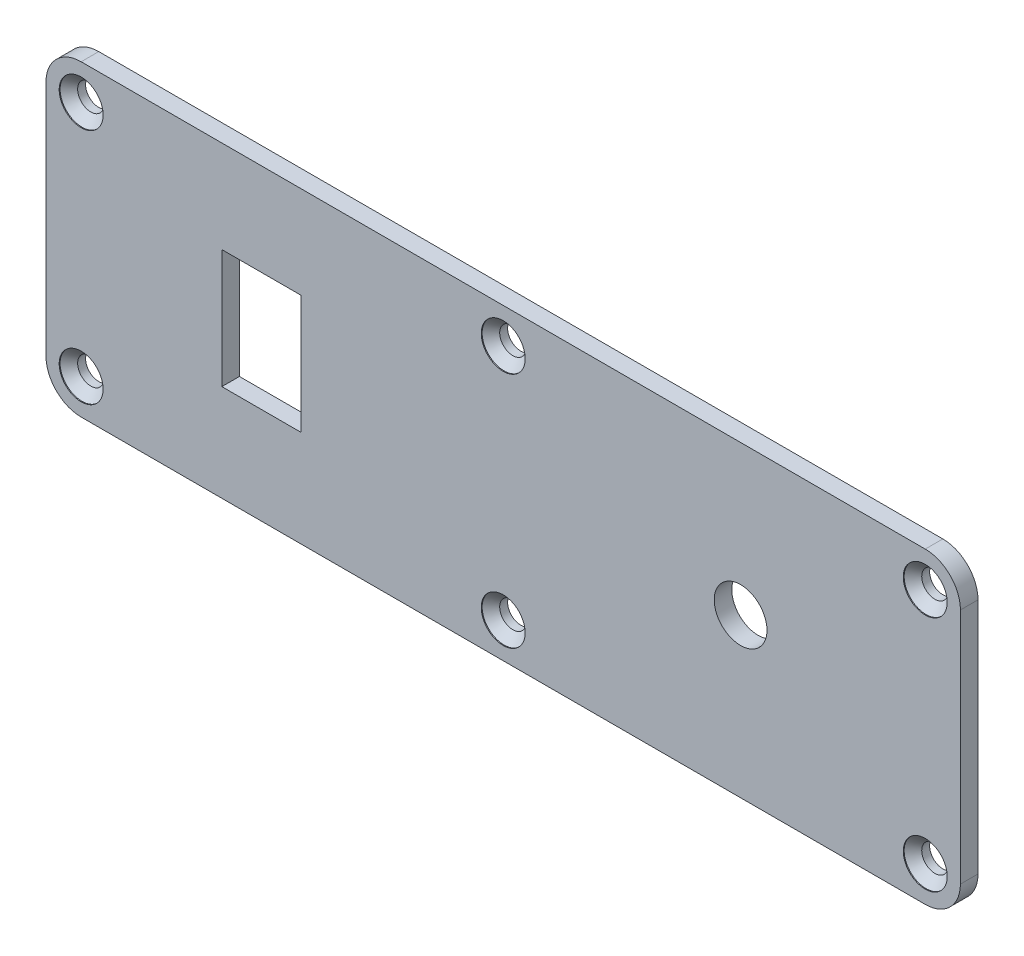
ISO-10303-21;
HEADER;
FILE_DESCRIPTION(('STEP AP214'),'2;1');
FILE_NAME('part.step','',(''),(''),'','','');
FILE_SCHEMA(('AUTOMOTIVE_DESIGN { 1 0 10303 214 1 1 1 1 }'));
ENDSEC;
DATA;
#1=APPLICATION_CONTEXT('core data for automotive mechanical design processes');
#2=APPLICATION_PROTOCOL_DEFINITION('international standard','automotive_design',2000,#1);
#3=PRODUCT_CONTEXT('',#1,'mechanical');
#4=PRODUCT('Part','Part','',(#3));
#5=PRODUCT_RELATED_PRODUCT_CATEGORY('part','',(#4));
#6=PRODUCT_DEFINITION_FORMATION('','',#4);
#7=PRODUCT_DEFINITION_CONTEXT('part definition',#1,'design');
#8=PRODUCT_DEFINITION('design','',#6,#7);
#9=PRODUCT_DEFINITION_SHAPE('','',#8);
#10=(LENGTH_UNIT() NAMED_UNIT(*) SI_UNIT(.MILLI.,.METRE.));
#11=(NAMED_UNIT(*) PLANE_ANGLE_UNIT() SI_UNIT($,.RADIAN.));
#12=(NAMED_UNIT(*) SI_UNIT($,.STERADIAN.) SOLID_ANGLE_UNIT());
#13=UNCERTAINTY_MEASURE_WITH_UNIT(LENGTH_MEASURE(1.E-05),#10,'distance_accuracy_value','');
#14=(GEOMETRIC_REPRESENTATION_CONTEXT(3) GLOBAL_UNCERTAINTY_ASSIGNED_CONTEXT((#13)) GLOBAL_UNIT_ASSIGNED_CONTEXT((#10,
#11,#12)) REPRESENTATION_CONTEXT('',''));
#15=CARTESIAN_POINT('',(0.,0.,0.));
#16=DIRECTION('',(0.,0.,1.));
#17=DIRECTION('',(1.,0.,0.));
#18=AXIS2_PLACEMENT_3D('',#15,#16,#17);
#19=CARTESIAN_POINT('',(-52.,4.00000000000001,0.));
#20=DIRECTION('',(0.,0.,1.));
#21=DIRECTION('',(1.,0.,0.));
#22=AXIS2_PLACEMENT_3D('',#19,#20,#21);
#23=CYLINDRICAL_SURFACE('',#22,1.5);
#24=CARTESIAN_POINT('',(-52.,4.00000000000001,0.900000000000003));
#25=DIRECTION('',(0.,0.,1.));
#26=DIRECTION('',(1.,0.,0.));
#27=AXIS2_PLACEMENT_3D('',#24,#25,#26);
#28=CIRCLE('',#27,1.5);
#29=CARTESIAN_POINT('',(-50.5,4.00000000000001,0.900000000000003));
#30=VERTEX_POINT('',#29);
#31=EDGE_CURVE('E251',#30,#30,#28,.T.);
#32=ORIENTED_EDGE('',*,*,#31,.T.);
#33=EDGE_LOOP('',(#32));
#34=FACE_BOUND('',#33,.T.);
#35=CARTESIAN_POINT('',(-52.,4.00000000000001,0.));
#36=DIRECTION('',(0.,0.,1.));
#37=DIRECTION('',(1.,0.,0.));
#38=AXIS2_PLACEMENT_3D('',#35,#36,#37);
#39=CIRCLE('',#38,1.5);
#40=CARTESIAN_POINT('',(-50.5,4.00000000000001,0.));
#41=VERTEX_POINT('',#40);
#42=EDGE_CURVE('E163',#41,#41,#39,.T.);
#43=ORIENTED_EDGE('',*,*,#42,.F.);
#44=EDGE_LOOP('',(#43));
#45=FACE_BOUND('',#44,.T.);
#46=ADVANCED_FACE('F33',(#34,#45),#23,.F.);
#47=CARTESIAN_POINT('',(-52.,31.,0.));
#48=DIRECTION('',(0.,0.,1.));
#49=DIRECTION('',(1.,0.,0.));
#50=AXIS2_PLACEMENT_3D('',#47,#48,#49);
#51=CYLINDRICAL_SURFACE('',#50,1.5);
#52=CARTESIAN_POINT('',(-52.,31.,0.899999999999989));
#53=DIRECTION('',(0.,0.,1.));
#54=DIRECTION('',(1.,0.,0.));
#55=AXIS2_PLACEMENT_3D('',#52,#53,#54);
#56=CIRCLE('',#55,1.5);
#57=CARTESIAN_POINT('',(-50.5,31.,0.899999999999989));
#58=VERTEX_POINT('',#57);
#59=EDGE_CURVE('E254',#58,#58,#56,.T.);
#60=ORIENTED_EDGE('',*,*,#59,.T.);
#61=EDGE_LOOP('',(#60));
#62=FACE_BOUND('',#61,.T.);
#63=CARTESIAN_POINT('',(-52.,31.,0.));
#64=DIRECTION('',(0.,0.,1.));
#65=DIRECTION('',(1.,0.,0.));
#66=AXIS2_PLACEMENT_3D('',#63,#64,#65);
#67=CIRCLE('',#66,1.5);
#68=CARTESIAN_POINT('',(-50.5,31.,0.));
#69=VERTEX_POINT('',#68);
#70=EDGE_CURVE('E174',#69,#69,#67,.T.);
#71=ORIENTED_EDGE('',*,*,#70,.F.);
#72=EDGE_LOOP('',(#71));
#73=FACE_BOUND('',#72,.T.);
#74=ADVANCED_FACE('F334',(#62,#73),#51,.F.);
#75=CARTESIAN_POINT('',(-100.,31.,0.));
#76=DIRECTION('',(0.,0.,1.));
#77=DIRECTION('',(1.,0.,0.));
#78=AXIS2_PLACEMENT_3D('',#75,#76,#77);
#79=CYLINDRICAL_SURFACE('',#78,1.5);
#80=CARTESIAN_POINT('',(-100.,31.,0.899999999999976));
#81=DIRECTION('',(0.,0.,1.));
#82=DIRECTION('',(1.,0.,0.));
#83=AXIS2_PLACEMENT_3D('',#80,#81,#82);
#84=CIRCLE('',#83,1.5);
#85=CARTESIAN_POINT('',(-98.5,31.,0.899999999999976));
#86=VERTEX_POINT('',#85);
#87=EDGE_CURVE('E248',#86,#86,#84,.T.);
#88=ORIENTED_EDGE('',*,*,#87,.T.);
#89=EDGE_LOOP('',(#88));
#90=FACE_BOUND('',#89,.T.);
#91=CARTESIAN_POINT('',(-100.,31.,0.));
#92=DIRECTION('',(0.,0.,1.));
#93=DIRECTION('',(1.,0.,0.));
#94=AXIS2_PLACEMENT_3D('',#91,#92,#93);
#95=CIRCLE('',#94,1.5);
#96=CARTESIAN_POINT('',(-98.5,31.,0.));
#97=VERTEX_POINT('',#96);
#98=EDGE_CURVE('E207',#97,#97,#95,.T.);
#99=ORIENTED_EDGE('',*,*,#98,.F.);
#100=EDGE_LOOP('',(#99));
#101=FACE_BOUND('',#100,.T.);
#102=ADVANCED_FACE('F340',(#90,#101),#79,.F.);
#103=CARTESIAN_POINT('',(-100.,3.99999999999999,0.));
#104=DIRECTION('',(0.,0.,1.));
#105=DIRECTION('',(1.,0.,0.));
#106=AXIS2_PLACEMENT_3D('',#103,#104,#105);
#107=CYLINDRICAL_SURFACE('',#106,1.5);
#108=CARTESIAN_POINT('',(-100.,3.99999999999999,0.89999999999999));
#109=DIRECTION('',(0.,0.,1.));
#110=DIRECTION('',(1.,0.,0.));
#111=AXIS2_PLACEMENT_3D('',#108,#109,#110);
#112=CIRCLE('',#111,1.5);
#113=CARTESIAN_POINT('',(-98.5,3.99999999999999,0.89999999999999));
#114=VERTEX_POINT('',#113);
#115=EDGE_CURVE('E245',#114,#114,#112,.T.);
#116=ORIENTED_EDGE('',*,*,#115,.T.);
#117=EDGE_LOOP('',(#116));
#118=FACE_BOUND('',#117,.T.);
#119=CARTESIAN_POINT('',(-100.,3.99999999999999,0.));
#120=DIRECTION('',(0.,0.,1.));
#121=DIRECTION('',(1.,0.,0.));
#122=AXIS2_PLACEMENT_3D('',#119,#120,#121);
#123=CIRCLE('',#122,1.5);
#124=CARTESIAN_POINT('',(-98.5,3.99999999999999,0.));
#125=VERTEX_POINT('',#124);
#126=EDGE_CURVE('E204',#125,#125,#123,.T.);
#127=ORIENTED_EDGE('',*,*,#126,.F.);
#128=EDGE_LOOP('',(#127));
#129=FACE_BOUND('',#128,.T.);
#130=ADVANCED_FACE('F364',(#118,#129),#107,.F.);
#131=CARTESIAN_POINT('',(0.,0.,2.));
#132=DIRECTION('',(-1.,0.,0.));
#133=DIRECTION('',(0.,0.,1.));
#134=AXIS2_PLACEMENT_3D('',#131,#132,#133);
#135=PLANE('',#134);
#136=DIRECTION('',(0.,1.,0.));
#137=VECTOR('',#136,1.);
#138=CARTESIAN_POINT('',(0.,0.,2.));
#139=LINE('',#138,#137);
#140=CARTESIAN_POINT('',(0.,4.,2.));
#141=VERTEX_POINT('',#140);
#142=CARTESIAN_POINT('',(0.,31.,2.));
#143=VERTEX_POINT('',#142);
#144=EDGE_CURVE('E216',#141,#143,#139,.T.);
#145=ORIENTED_EDGE('',*,*,#144,.F.);
#146=DIRECTION('',(0.,0.,-1.));
#147=VECTOR('',#146,1.);
#148=CARTESIAN_POINT('',(0.,4.,2.));
#149=LINE('',#148,#147);
#150=CARTESIAN_POINT('',(0.,4.,0.));
#151=VERTEX_POINT('',#150);
#152=EDGE_CURVE('E259',#141,#151,#149,.T.);
#153=ORIENTED_EDGE('',*,*,#152,.T.);
#154=DIRECTION('',(0.,1.,0.));
#155=VECTOR('',#154,1.);
#156=CARTESIAN_POINT('',(0.,0.,0.));
#157=LINE('',#156,#155);
#158=CARTESIAN_POINT('',(0.,31.,0.));
#159=VERTEX_POINT('',#158);
#160=EDGE_CURVE('E215',#151,#159,#157,.T.);
#161=ORIENTED_EDGE('',*,*,#160,.T.);
#162=DIRECTION('',(0.,0.,-1.));
#163=VECTOR('',#162,1.);
#164=CARTESIAN_POINT('',(0.,31.,2.));
#165=LINE('',#164,#163);
#166=EDGE_CURVE('E257',#159,#143,#165,.F.);
#167=ORIENTED_EDGE('',*,*,#166,.T.);
#168=EDGE_LOOP('',(#145,#153,#161,#167));
#169=FACE_BOUND('',#168,.T.);
#170=ADVANCED_FACE('F316',(#169),#135,.F.);
#171=CARTESIAN_POINT('',(0.,35.,2.));
#172=DIRECTION('',(0.,-1.,0.));
#173=DIRECTION('',(1.,0.,0.));
#174=AXIS2_PLACEMENT_3D('',#171,#172,#173);
#175=PLANE('',#174);
#176=DIRECTION('',(-1.,0.,0.));
#177=VECTOR('',#176,1.);
#178=CARTESIAN_POINT('',(0.,35.,2.));
#179=LINE('',#178,#177);
#180=CARTESIAN_POINT('',(-4.,35.,2.));
#181=VERTEX_POINT('',#180);
#182=CARTESIAN_POINT('',(-100.,35.,2.));
#183=VERTEX_POINT('',#182);
#184=EDGE_CURVE('E219',#181,#183,#179,.T.);
#185=ORIENTED_EDGE('',*,*,#184,.F.);
#186=DIRECTION('',(0.,0.,-1.));
#187=VECTOR('',#186,1.);
#188=CARTESIAN_POINT('',(-4.,35.,2.));
#189=LINE('',#188,#187);
#190=CARTESIAN_POINT('',(-4.,35.,0.));
#191=VERTEX_POINT('',#190);
#192=EDGE_CURVE('E285',#181,#191,#189,.T.);
#193=ORIENTED_EDGE('',*,*,#192,.T.);
#194=DIRECTION('',(-1.,0.,0.));
#195=VECTOR('',#194,1.);
#196=CARTESIAN_POINT('',(0.,35.,0.));
#197=LINE('',#196,#195);
#198=CARTESIAN_POINT('',(-100.,35.,0.));
#199=VERTEX_POINT('',#198);
#200=EDGE_CURVE('E232',#191,#199,#197,.T.);
#201=ORIENTED_EDGE('',*,*,#200,.T.);
#202=DIRECTION('',(0.,0.,-1.));
#203=VECTOR('',#202,1.);
#204=CARTESIAN_POINT('',(-100.,35.,2.));
#205=LINE('',#204,#203);
#206=EDGE_CURVE('E283',#199,#183,#205,.F.);
#207=ORIENTED_EDGE('',*,*,#206,.T.);
#208=EDGE_LOOP('',(#185,#193,#201,#207));
#209=FACE_BOUND('',#208,.T.);
#210=ADVANCED_FACE('F324',(#209),#175,.F.);
#211=CARTESIAN_POINT('',(-104.,0.,2.));
#212=DIRECTION('',(1.,0.,0.));
#213=DIRECTION('',(0.,0.,-1.));
#214=AXIS2_PLACEMENT_3D('',#211,#212,#213);
#215=PLANE('',#214);
#216=DIRECTION('',(0.,-1.,0.));
#217=VECTOR('',#216,1.);
#218=CARTESIAN_POINT('',(-104.,0.,0.));
#219=LINE('',#218,#217);
#220=CARTESIAN_POINT('',(-104.,31.,0.));
#221=VERTEX_POINT('',#220);
#222=CARTESIAN_POINT('',(-104.,4.,0.));
#223=VERTEX_POINT('',#222);
#224=EDGE_CURVE('E235',#221,#223,#219,.T.);
#225=ORIENTED_EDGE('',*,*,#224,.T.);
#226=DIRECTION('',(0.,0.,-1.));
#227=VECTOR('',#226,1.);
#228=CARTESIAN_POINT('',(-104.,4.,2.));
#229=LINE('',#228,#227);
#230=CARTESIAN_POINT('',(-104.,4.,2.));
#231=VERTEX_POINT('',#230);
#232=EDGE_CURVE('E11',#223,#231,#229,.F.);
#233=ORIENTED_EDGE('',*,*,#232,.T.);
#234=DIRECTION('',(0.,-1.,0.));
#235=VECTOR('',#234,1.);
#236=CARTESIAN_POINT('',(-104.,0.,2.));
#237=LINE('',#236,#235);
#238=CARTESIAN_POINT('',(-104.,31.,2.));
#239=VERTEX_POINT('',#238);
#240=EDGE_CURVE('E223',#239,#231,#237,.T.);
#241=ORIENTED_EDGE('',*,*,#240,.F.);
#242=DIRECTION('',(0.,0.,-1.));
#243=VECTOR('',#242,1.);
#244=CARTESIAN_POINT('',(-104.,31.,2.));
#245=LINE('',#244,#243);
#246=EDGE_CURVE('E41',#239,#221,#245,.T.);
#247=ORIENTED_EDGE('',*,*,#246,.T.);
#248=EDGE_LOOP('',(#225,#233,#241,#247));
#249=FACE_BOUND('',#248,.T.);
#250=ADVANCED_FACE('F292',(#249),#215,.F.);
#251=CARTESIAN_POINT('',(0.,0.,2.));
#252=DIRECTION('',(0.,1.,0.));
#253=DIRECTION('',(0.,0.,1.));
#254=AXIS2_PLACEMENT_3D('',#251,#252,#253);
#255=PLANE('',#254);
#256=DIRECTION('',(1.,0.,0.));
#257=VECTOR('',#256,1.);
#258=CARTESIAN_POINT('',(0.,0.,0.));
#259=LINE('',#258,#257);
#260=CARTESIAN_POINT('',(-100.,0.,0.));
#261=VERTEX_POINT('',#260);
#262=CARTESIAN_POINT('',(-4.,0.,0.));
#263=VERTEX_POINT('',#262);
#264=EDGE_CURVE('E220',#261,#263,#259,.T.);
#265=ORIENTED_EDGE('',*,*,#264,.T.);
#266=DIRECTION('',(0.,0.,-1.));
#267=VECTOR('',#266,1.);
#268=CARTESIAN_POINT('',(-4.,0.,2.));
#269=LINE('',#268,#267);
#270=CARTESIAN_POINT('',(-4.,0.,2.));
#271=VERTEX_POINT('',#270);
#272=EDGE_CURVE('E273',#263,#271,#269,.F.);
#273=ORIENTED_EDGE('',*,*,#272,.T.);
#274=DIRECTION('',(1.,0.,0.));
#275=VECTOR('',#274,1.);
#276=CARTESIAN_POINT('',(0.,0.,2.));
#277=LINE('',#276,#275);
#278=CARTESIAN_POINT('',(-100.,0.,2.));
#279=VERTEX_POINT('',#278);
#280=EDGE_CURVE('E226',#279,#271,#277,.T.);
#281=ORIENTED_EDGE('',*,*,#280,.F.);
#282=DIRECTION('',(0.,0.,-1.));
#283=VECTOR('',#282,1.);
#284=CARTESIAN_POINT('',(-100.,0.,2.));
#285=LINE('',#284,#283);
#286=EDGE_CURVE('E270',#279,#261,#285,.T.);
#287=ORIENTED_EDGE('',*,*,#286,.T.);
#288=EDGE_LOOP('',(#265,#273,#281,#287));
#289=FACE_BOUND('',#288,.T.);
#290=ADVANCED_FACE('F306',(#289),#255,.F.);
#291=CARTESIAN_POINT('',(0.,0.,2.));
#292=DIRECTION('',(0.,0.,1.));
#293=DIRECTION('',(1.,0.,0.));
#294=AXIS2_PLACEMENT_3D('',#291,#292,#293);
#295=PLANE('',#294);
#296=CARTESIAN_POINT('',(-25.,18.,2.));
#297=DIRECTION('',(0.,0.,1.));
#298=DIRECTION('',(1.,0.,0.));
#299=AXIS2_PLACEMENT_3D('',#296,#297,#298);
#300=CIRCLE('',#299,3.);
#301=CARTESIAN_POINT('',(-22.,18.,2.));
#302=VERTEX_POINT('',#301);
#303=EDGE_CURVE('E145',#302,#302,#300,.T.);
#304=ORIENTED_EDGE('',*,*,#303,.F.);
#305=EDGE_LOOP('',(#304));
#306=FACE_BOUND('',#305,.T.);
#307=DIRECTION('',(0.,-1.,0.));
#308=VECTOR('',#307,1.);
#309=CARTESIAN_POINT('',(-84.,24.5,2.));
#310=LINE('',#309,#308);
#311=CARTESIAN_POINT('',(-84.,24.5,2.));
#312=VERTEX_POINT('',#311);
#313=CARTESIAN_POINT('',(-84.,11.,2.));
#314=VERTEX_POINT('',#313);
#315=EDGE_CURVE('E48',#312,#314,#310,.T.);
#316=ORIENTED_EDGE('',*,*,#315,.F.);
#317=DIRECTION('',(-1.,0.,0.));
#318=VECTOR('',#317,1.);
#319=CARTESIAN_POINT('',(-84.,24.5,2.));
#320=LINE('',#319,#318);
#321=CARTESIAN_POINT('',(-75.,24.5,2.));
#322=VERTEX_POINT('',#321);
#323=EDGE_CURVE('E139',#322,#312,#320,.T.);
#324=ORIENTED_EDGE('',*,*,#323,.F.);
#325=DIRECTION('',(0.,1.,0.));
#326=VECTOR('',#325,1.);
#327=CARTESIAN_POINT('',(-75.,24.5,2.));
#328=LINE('',#327,#326);
#329=CARTESIAN_POINT('',(-75.,11.,2.));
#330=VERTEX_POINT('',#329);
#331=EDGE_CURVE('E142',#330,#322,#328,.T.);
#332=ORIENTED_EDGE('',*,*,#331,.F.);
#333=DIRECTION('',(1.,0.,0.));
#334=VECTOR('',#333,1.);
#335=CARTESIAN_POINT('',(-84.,11.,2.));
#336=LINE('',#335,#334);
#337=EDGE_CURVE('E151',#314,#330,#336,.T.);
#338=ORIENTED_EDGE('',*,*,#337,.F.);
#339=EDGE_LOOP('',(#316,#324,#332,#338));
#340=FACE_BOUND('',#339,.T.);
#341=CARTESIAN_POINT('',(-52.,31.,2.));
#342=DIRECTION('',(0.,0.,1.));
#343=DIRECTION('',(1.,0.,0.));
#344=AXIS2_PLACEMENT_3D('',#341,#342,#343);
#345=CIRCLE('',#344,2.5);
#346=CARTESIAN_POINT('',(-49.5,31.,2.));
#347=VERTEX_POINT('',#346);
#348=EDGE_CURVE('E164',#347,#347,#345,.T.);
#349=ORIENTED_EDGE('',*,*,#348,.F.);
#350=EDGE_LOOP('',(#349));
#351=FACE_BOUND('',#350,.T.);
#352=CARTESIAN_POINT('',(-52.,4.00000000000001,2.));
#353=DIRECTION('',(0.,0.,1.));
#354=DIRECTION('',(1.,0.,0.));
#355=AXIS2_PLACEMENT_3D('',#352,#353,#354);
#356=CIRCLE('',#355,2.5);
#357=CARTESIAN_POINT('',(-49.5,4.00000000000001,2.));
#358=VERTEX_POINT('',#357);
#359=EDGE_CURVE('E170',#358,#358,#356,.T.);
#360=ORIENTED_EDGE('',*,*,#359,.F.);
#361=EDGE_LOOP('',(#360));
#362=FACE_BOUND('',#361,.T.);
#363=CARTESIAN_POINT('',(-3.99999999999998,30.9999999999999,2.));
#364=DIRECTION('',(0.,0.,1.));
#365=DIRECTION('',(-1.,0.,0.));
#366=AXIS2_PLACEMENT_3D('',#363,#364,#365);
#367=CIRCLE('',#366,2.50000000000001);
#368=CARTESIAN_POINT('',(-6.49999999999999,30.9999999999999,2.));
#369=VERTEX_POINT('',#368);
#370=EDGE_CURVE('E177',#369,#369,#367,.T.);
#371=ORIENTED_EDGE('',*,*,#370,.F.);
#372=EDGE_LOOP('',(#371));
#373=FACE_BOUND('',#372,.T.);
#374=CARTESIAN_POINT('',(-4.00000000000003,3.99999999999992,2.));
#375=DIRECTION('',(0.,0.,1.));
#376=DIRECTION('',(-1.,0.,0.));
#377=AXIS2_PLACEMENT_3D('',#374,#375,#376);
#378=CIRCLE('',#377,2.5);
#379=CARTESIAN_POINT('',(-6.50000000000003,3.99999999999992,2.));
#380=VERTEX_POINT('',#379);
#381=EDGE_CURVE('E190',#380,#380,#378,.T.);
#382=ORIENTED_EDGE('',*,*,#381,.F.);
#383=EDGE_LOOP('',(#382));
#384=FACE_BOUND('',#383,.T.);
#385=CARTESIAN_POINT('',(-100.,3.99999999999999,2.));
#386=DIRECTION('',(0.,0.,1.));
#387=DIRECTION('',(1.,0.,0.));
#388=AXIS2_PLACEMENT_3D('',#385,#386,#387);
#389=CIRCLE('',#388,2.50000000000001);
#390=CARTESIAN_POINT('',(-97.5,3.99999999999999,2.));
#391=VERTEX_POINT('',#390);
#392=EDGE_CURVE('E184',#391,#391,#389,.T.);
#393=ORIENTED_EDGE('',*,*,#392,.F.);
#394=EDGE_LOOP('',(#393));
#395=FACE_BOUND('',#394,.T.);
#396=CARTESIAN_POINT('',(-100.,31.,2.));
#397=DIRECTION('',(0.,0.,1.));
#398=DIRECTION('',(1.,0.,0.));
#399=AXIS2_PLACEMENT_3D('',#396,#397,#398);
#400=CIRCLE('',#399,2.50000000000001);
#401=CARTESIAN_POINT('',(-97.5,31.,2.));
#402=VERTEX_POINT('',#401);
#403=EDGE_CURVE('E183',#402,#402,#400,.T.);
#404=ORIENTED_EDGE('',*,*,#403,.F.);
#405=EDGE_LOOP('',(#404));
#406=FACE_BOUND('',#405,.T.);
#407=ORIENTED_EDGE('',*,*,#280,.T.);
#408=CARTESIAN_POINT('',(-4.,4.,2.));
#409=DIRECTION('',(0.,0.,1.));
#410=DIRECTION('',(1.,0.,0.));
#411=AXIS2_PLACEMENT_3D('',#408,#409,#410);
#412=CIRCLE('',#411,4.);
#413=EDGE_CURVE('E281',#271,#141,#412,.T.);
#414=ORIENTED_EDGE('',*,*,#413,.T.);
#415=ORIENTED_EDGE('',*,*,#144,.T.);
#416=CARTESIAN_POINT('',(-4.,31.,2.));
#417=DIRECTION('',(0.,0.,1.));
#418=DIRECTION('',(1.,0.,0.));
#419=AXIS2_PLACEMENT_3D('',#416,#417,#418);
#420=CIRCLE('',#419,4.);
#421=EDGE_CURVE('E279',#143,#181,#420,.T.);
#422=ORIENTED_EDGE('',*,*,#421,.T.);
#423=ORIENTED_EDGE('',*,*,#184,.T.);
#424=CARTESIAN_POINT('',(-100.,31.,2.));
#425=DIRECTION('',(0.,0.,1.));
#426=DIRECTION('',(1.,0.,0.));
#427=AXIS2_PLACEMENT_3D('',#424,#425,#426);
#428=CIRCLE('',#427,4.);
#429=EDGE_CURVE('E275',#183,#239,#428,.T.);
#430=ORIENTED_EDGE('',*,*,#429,.T.);
#431=ORIENTED_EDGE('',*,*,#240,.T.);
#432=CARTESIAN_POINT('',(-100.,4.,2.));
#433=DIRECTION('',(0.,0.,1.));
#434=DIRECTION('',(1.,0.,0.));
#435=AXIS2_PLACEMENT_3D('',#432,#433,#434);
#436=CIRCLE('',#435,4.);
#437=EDGE_CURVE('E277',#231,#279,#436,.T.);
#438=ORIENTED_EDGE('',*,*,#437,.T.);
#439=EDGE_LOOP('',(#407,#414,#415,#422,#423,#430,#431,#438));
#440=FACE_BOUND('',#439,.T.);
#441=ADVANCED_FACE('F310',(#306,#340,#351,#362,#373,#384,#395,#406,#440),#295,.T.);
#442=CARTESIAN_POINT('',(0.,0.,0.));
#443=DIRECTION('',(0.,0.,1.));
#444=DIRECTION('',(1.,0.,0.));
#445=AXIS2_PLACEMENT_3D('',#442,#443,#444);
#446=PLANE('',#445);
#447=CARTESIAN_POINT('',(-25.,18.,0.));
#448=DIRECTION('',(0.,0.,1.));
#449=DIRECTION('',(1.,0.,0.));
#450=AXIS2_PLACEMENT_3D('',#447,#448,#449);
#451=CIRCLE('',#450,3.);
#452=CARTESIAN_POINT('',(-22.,18.,0.));
#453=VERTEX_POINT('',#452);
#454=EDGE_CURVE('E173',#453,#453,#451,.T.);
#455=ORIENTED_EDGE('',*,*,#454,.T.);
#456=EDGE_LOOP('',(#455));
#457=FACE_BOUND('',#456,.T.);
#458=DIRECTION('',(-1.,0.,0.));
#459=VECTOR('',#458,1.);
#460=CARTESIAN_POINT('',(-84.,24.5,0.));
#461=LINE('',#460,#459);
#462=CARTESIAN_POINT('',(-75.,24.5,0.));
#463=VERTEX_POINT('',#462);
#464=CARTESIAN_POINT('',(-84.,24.5,0.));
#465=VERTEX_POINT('',#464);
#466=EDGE_CURVE('E129',#463,#465,#461,.T.);
#467=ORIENTED_EDGE('',*,*,#466,.T.);
#468=DIRECTION('',(0.,-1.,0.));
#469=VECTOR('',#468,1.);
#470=CARTESIAN_POINT('',(-84.,24.5,0.));
#471=LINE('',#470,#469);
#472=CARTESIAN_POINT('',(-84.,11.,0.));
#473=VERTEX_POINT('',#472);
#474=EDGE_CURVE('E123',#465,#473,#471,.T.);
#475=ORIENTED_EDGE('',*,*,#474,.T.);
#476=DIRECTION('',(1.,0.,0.));
#477=VECTOR('',#476,1.);
#478=CARTESIAN_POINT('',(-84.,11.,0.));
#479=LINE('',#478,#477);
#480=CARTESIAN_POINT('',(-75.,11.,0.));
#481=VERTEX_POINT('',#480);
#482=EDGE_CURVE('E132',#473,#481,#479,.T.);
#483=ORIENTED_EDGE('',*,*,#482,.T.);
#484=DIRECTION('',(0.,1.,0.));
#485=VECTOR('',#484,1.);
#486=CARTESIAN_POINT('',(-75.,24.5,0.));
#487=LINE('',#486,#485);
#488=EDGE_CURVE('E56',#481,#463,#487,.T.);
#489=ORIENTED_EDGE('',*,*,#488,.T.);
#490=EDGE_LOOP('',(#467,#475,#483,#489));
#491=FACE_BOUND('',#490,.T.);
#492=ORIENTED_EDGE('',*,*,#70,.T.);
#493=EDGE_LOOP('',(#492));
#494=FACE_BOUND('',#493,.T.);
#495=ORIENTED_EDGE('',*,*,#42,.T.);
#496=EDGE_LOOP('',(#495));
#497=FACE_BOUND('',#496,.T.);
#498=CARTESIAN_POINT('',(-4.,31.,0.));
#499=DIRECTION('',(0.,0.,1.));
#500=DIRECTION('',(-1.,0.,0.));
#501=AXIS2_PLACEMENT_3D('',#498,#499,#500);
#502=CIRCLE('',#501,1.5);
#503=CARTESIAN_POINT('',(-5.5,31.,0.));
#504=VERTEX_POINT('',#503);
#505=EDGE_CURVE('E201',#504,#504,#502,.T.);
#506=ORIENTED_EDGE('',*,*,#505,.T.);
#507=EDGE_LOOP('',(#506));
#508=FACE_BOUND('',#507,.T.);
#509=CARTESIAN_POINT('',(-3.99999999999999,4.00000000000001,0.));
#510=DIRECTION('',(0.,0.,1.));
#511=DIRECTION('',(-1.,0.,0.));
#512=AXIS2_PLACEMENT_3D('',#509,#510,#511);
#513=CIRCLE('',#512,1.49999999999998);
#514=CARTESIAN_POINT('',(-5.49999999999997,4.00000000000001,0.));
#515=VERTEX_POINT('',#514);
#516=EDGE_CURVE('E208',#515,#515,#513,.T.);
#517=ORIENTED_EDGE('',*,*,#516,.T.);
#518=EDGE_LOOP('',(#517));
#519=FACE_BOUND('',#518,.T.);
#520=ORIENTED_EDGE('',*,*,#126,.T.);
#521=EDGE_LOOP('',(#520));
#522=FACE_BOUND('',#521,.T.);
#523=ORIENTED_EDGE('',*,*,#98,.T.);
#524=EDGE_LOOP('',(#523));
#525=FACE_BOUND('',#524,.T.);
#526=ORIENTED_EDGE('',*,*,#160,.F.);
#527=CARTESIAN_POINT('',(-4.,4.,0.));
#528=DIRECTION('',(0.,0.,1.));
#529=DIRECTION('',(1.,0.,0.));
#530=AXIS2_PLACEMENT_3D('',#527,#528,#529);
#531=CIRCLE('',#530,4.);
#532=EDGE_CURVE('E268',#151,#263,#531,.F.);
#533=ORIENTED_EDGE('',*,*,#532,.T.);
#534=ORIENTED_EDGE('',*,*,#264,.F.);
#535=CARTESIAN_POINT('',(-100.,4.,0.));
#536=DIRECTION('',(0.,0.,1.));
#537=DIRECTION('',(1.,0.,0.));
#538=AXIS2_PLACEMENT_3D('',#535,#536,#537);
#539=CIRCLE('',#538,4.);
#540=EDGE_CURVE('E264',#261,#223,#539,.F.);
#541=ORIENTED_EDGE('',*,*,#540,.T.);
#542=ORIENTED_EDGE('',*,*,#224,.F.);
#543=CARTESIAN_POINT('',(-100.,31.,0.));
#544=DIRECTION('',(0.,0.,1.));
#545=DIRECTION('',(1.,0.,0.));
#546=AXIS2_PLACEMENT_3D('',#543,#544,#545);
#547=CIRCLE('',#546,4.);
#548=EDGE_CURVE('E262',#221,#199,#547,.F.);
#549=ORIENTED_EDGE('',*,*,#548,.T.);
#550=ORIENTED_EDGE('',*,*,#200,.F.);
#551=CARTESIAN_POINT('',(-4.,31.,0.));
#552=DIRECTION('',(0.,0.,1.));
#553=DIRECTION('',(1.,0.,0.));
#554=AXIS2_PLACEMENT_3D('',#551,#552,#553);
#555=CIRCLE('',#554,4.);
#556=EDGE_CURVE('E266',#191,#159,#555,.F.);
#557=ORIENTED_EDGE('',*,*,#556,.T.);
#558=EDGE_LOOP('',(#526,#533,#534,#541,#542,#549,#550,#557));
#559=FACE_BOUND('',#558,.T.);
#560=ADVANCED_FACE('F136',(#457,#491,#494,#497,#508,#519,#522,#525,#559),#446,.F.);
#561=CARTESIAN_POINT('',(-3.99999999999999,4.00000000000001,0.));
#562=DIRECTION('',(0.,0.,1.));
#563=DIRECTION('',(1.,0.,0.));
#564=AXIS2_PLACEMENT_3D('',#561,#562,#563);
#565=CYLINDRICAL_SURFACE('',#564,1.49999999999998);
#566=CARTESIAN_POINT('',(-3.99999999999999,4.00000000000001,0.89999999999999));
#567=DIRECTION('',(0.,0.,-1.));
#568=DIRECTION('',(-1.,0.,0.));
#569=AXIS2_PLACEMENT_3D('',#566,#567,#568);
#570=CIRCLE('',#569,1.49999999999998);
#571=CARTESIAN_POINT('',(-5.49999999999997,4.00000000000001,0.89999999999999));
#572=VERTEX_POINT('',#571);
#573=EDGE_CURVE('E229',#572,#572,#570,.F.);
#574=ORIENTED_EDGE('',*,*,#573,.T.);
#575=EDGE_LOOP('',(#574));
#576=FACE_BOUND('',#575,.T.);
#577=ORIENTED_EDGE('',*,*,#516,.F.);
#578=EDGE_LOOP('',(#577));
#579=FACE_BOUND('',#578,.T.);
#580=ADVANCED_FACE('F368',(#576,#579),#565,.F.);
#581=CARTESIAN_POINT('',(-4.,31.,0.));
#582=DIRECTION('',(0.,0.,1.));
#583=DIRECTION('',(1.,0.,0.));
#584=AXIS2_PLACEMENT_3D('',#581,#582,#583);
#585=CYLINDRICAL_SURFACE('',#584,1.5);
#586=CARTESIAN_POINT('',(-4.,31.,0.900000000000003));
#587=DIRECTION('',(0.,0.,-1.));
#588=DIRECTION('',(-1.,0.,0.));
#589=AXIS2_PLACEMENT_3D('',#586,#587,#588);
#590=CIRCLE('',#589,1.5);
#591=CARTESIAN_POINT('',(-5.5,31.,0.900000000000003));
#592=VERTEX_POINT('',#591);
#593=EDGE_CURVE('E242',#592,#592,#590,.F.);
#594=ORIENTED_EDGE('',*,*,#593,.T.);
#595=EDGE_LOOP('',(#594));
#596=FACE_BOUND('',#595,.T.);
#597=ORIENTED_EDGE('',*,*,#505,.F.);
#598=EDGE_LOOP('',(#597));
#599=FACE_BOUND('',#598,.T.);
#600=ADVANCED_FACE('F358',(#596,#599),#585,.F.);
#601=CARTESIAN_POINT('',(-3.99999999999998,30.9999999999999,1.9));
#602=DIRECTION('',(0.,0.,1.));
#603=DIRECTION('',(1.,0.,0.));
#604=AXIS2_PLACEMENT_3D('',#601,#602,#603);
#605=CYLINDRICAL_SURFACE('',#604,2.50000000000001);
#606=CARTESIAN_POINT('',(-3.99999999999998,30.9999999999999,1.9));
#607=DIRECTION('',(0.,0.,1.));
#608=DIRECTION('',(-1.,0.,0.));
#609=AXIS2_PLACEMENT_3D('',#606,#607,#608);
#610=CIRCLE('',#609,2.50000000000001);
#611=CARTESIAN_POINT('',(-6.49999999999999,30.9999999999999,1.9));
#612=VERTEX_POINT('',#611);
#613=EDGE_CURVE('E193',#612,#612,#610,.T.);
#614=ORIENTED_EDGE('',*,*,#613,.F.);
#615=EDGE_LOOP('',(#614));
#616=FACE_BOUND('',#615,.T.);
#617=ORIENTED_EDGE('',*,*,#370,.T.);
#618=EDGE_LOOP('',(#617));
#619=FACE_BOUND('',#618,.T.);
#620=ADVANCED_FACE('F354',(#616,#619),#605,.F.);
#621=CARTESIAN_POINT('',(-4.00000000000003,3.99999999999992,1.9));
#622=DIRECTION('',(0.,0.,1.));
#623=DIRECTION('',(1.,0.,0.));
#624=AXIS2_PLACEMENT_3D('',#621,#622,#623);
#625=CYLINDRICAL_SURFACE('',#624,2.5);
#626=CARTESIAN_POINT('',(-4.00000000000003,3.99999999999992,1.9));
#627=DIRECTION('',(0.,0.,1.));
#628=DIRECTION('',(-1.,0.,0.));
#629=AXIS2_PLACEMENT_3D('',#626,#627,#628);
#630=CIRCLE('',#629,2.5);
#631=CARTESIAN_POINT('',(-6.50000000000003,3.99999999999992,1.9));
#632=VERTEX_POINT('',#631);
#633=EDGE_CURVE('E187',#632,#632,#630,.T.);
#634=ORIENTED_EDGE('',*,*,#633,.F.);
#635=EDGE_LOOP('',(#634));
#636=FACE_BOUND('',#635,.T.);
#637=ORIENTED_EDGE('',*,*,#381,.T.);
#638=EDGE_LOOP('',(#637));
#639=FACE_BOUND('',#638,.T.);
#640=ADVANCED_FACE('F350',(#636,#639),#625,.F.);
#641=CARTESIAN_POINT('',(-100.,3.99999999999999,1.9));
#642=DIRECTION('',(0.,0.,1.));
#643=DIRECTION('',(1.,0.,0.));
#644=AXIS2_PLACEMENT_3D('',#641,#642,#643);
#645=CYLINDRICAL_SURFACE('',#644,2.50000000000001);
#646=CARTESIAN_POINT('',(-100.,3.99999999999999,1.9));
#647=DIRECTION('',(0.,0.,1.));
#648=DIRECTION('',(1.,0.,0.));
#649=AXIS2_PLACEMENT_3D('',#646,#647,#648);
#650=CIRCLE('',#649,2.50000000000001);
#651=CARTESIAN_POINT('',(-97.5,3.99999999999999,1.9));
#652=VERTEX_POINT('',#651);
#653=EDGE_CURVE('E180',#652,#652,#650,.T.);
#654=ORIENTED_EDGE('',*,*,#653,.F.);
#655=EDGE_LOOP('',(#654));
#656=FACE_BOUND('',#655,.T.);
#657=ORIENTED_EDGE('',*,*,#392,.T.);
#658=EDGE_LOOP('',(#657));
#659=FACE_BOUND('',#658,.T.);
#660=ADVANCED_FACE('F346',(#656,#659),#645,.F.);
#661=CARTESIAN_POINT('',(-100.,31.,1.9));
#662=DIRECTION('',(0.,0.,1.));
#663=DIRECTION('',(1.,0.,0.));
#664=AXIS2_PLACEMENT_3D('',#661,#662,#663);
#665=CYLINDRICAL_SURFACE('',#664,2.50000000000001);
#666=CARTESIAN_POINT('',(-100.,31.,1.9));
#667=DIRECTION('',(0.,0.,1.));
#668=DIRECTION('',(1.,0.,0.));
#669=AXIS2_PLACEMENT_3D('',#666,#667,#668);
#670=CIRCLE('',#669,2.50000000000001);
#671=CARTESIAN_POINT('',(-97.5,31.,1.9));
#672=VERTEX_POINT('',#671);
#673=EDGE_CURVE('E198',#672,#672,#670,.T.);
#674=ORIENTED_EDGE('',*,*,#673,.F.);
#675=EDGE_LOOP('',(#674));
#676=FACE_BOUND('',#675,.T.);
#677=ORIENTED_EDGE('',*,*,#403,.T.);
#678=EDGE_LOOP('',(#677));
#679=FACE_BOUND('',#678,.T.);
#680=ADVANCED_FACE('F349',(#676,#679),#665,.F.);
#681=CARTESIAN_POINT('',(-3.99999999999999,4.00000000000001,0.899999999999991));
#682=DIRECTION('',(0.,0.,1.));
#683=DIRECTION('',(1.,0.,0.));
#684=AXIS2_PLACEMENT_3D('',#681,#682,#683);
#685=CONICAL_SURFACE('',#684,1.49999999999998,0.785398163397453);
#686=ORIENTED_EDGE('',*,*,#633,.T.);
#687=EDGE_LOOP('',(#686));
#688=FACE_BOUND('',#687,.T.);
#689=ORIENTED_EDGE('',*,*,#573,.F.);
#690=EDGE_LOOP('',(#689));
#691=FACE_BOUND('',#690,.T.);
#692=ADVANCED_FACE('F362',(#688,#691),#685,.F.);
#693=CARTESIAN_POINT('',(-4.,31.,0.900000000000003));
#694=DIRECTION('',(0.,0.,1.));
#695=DIRECTION('',(1.,0.,0.));
#696=AXIS2_PLACEMENT_3D('',#693,#694,#695);
#697=CONICAL_SURFACE('',#696,1.5,0.785398163397453);
#698=ORIENTED_EDGE('',*,*,#613,.T.);
#699=EDGE_LOOP('',(#698));
#700=FACE_BOUND('',#699,.T.);
#701=ORIENTED_EDGE('',*,*,#593,.F.);
#702=EDGE_LOOP('',(#701));
#703=FACE_BOUND('',#702,.T.);
#704=ADVANCED_FACE('F394',(#700,#703),#697,.F.);
#705=CARTESIAN_POINT('',(-100.,3.99999999999999,1.9));
#706=DIRECTION('',(0.,0.,1.));
#707=DIRECTION('',(1.,0.,0.));
#708=AXIS2_PLACEMENT_3D('',#705,#706,#707);
#709=CONICAL_SURFACE('',#708,2.50000000000002,0.785398163397452);
#710=ORIENTED_EDGE('',*,*,#115,.F.);
#711=EDGE_LOOP('',(#710));
#712=FACE_BOUND('',#711,.T.);
#713=ORIENTED_EDGE('',*,*,#653,.T.);
#714=EDGE_LOOP('',(#713));
#715=FACE_BOUND('',#714,.T.);
#716=ADVANCED_FACE('F398',(#712,#715),#709,.F.);
#717=CARTESIAN_POINT('',(-100.,31.,1.9));
#718=DIRECTION('',(0.,0.,1.));
#719=DIRECTION('',(1.,0.,0.));
#720=AXIS2_PLACEMENT_3D('',#717,#718,#719);
#721=CONICAL_SURFACE('',#720,2.50000000000003,0.785398163397453);
#722=ORIENTED_EDGE('',*,*,#87,.F.);
#723=EDGE_LOOP('',(#722));
#724=FACE_BOUND('',#723,.T.);
#725=ORIENTED_EDGE('',*,*,#673,.T.);
#726=EDGE_LOOP('',(#725));
#727=FACE_BOUND('',#726,.T.);
#728=ADVANCED_FACE('F402',(#724,#727),#721,.F.);
#729=CARTESIAN_POINT('',(-52.,31.,1.9));
#730=DIRECTION('',(0.,0.,1.));
#731=DIRECTION('',(1.,0.,0.));
#732=AXIS2_PLACEMENT_3D('',#729,#730,#731);
#733=CYLINDRICAL_SURFACE('',#732,2.5);
#734=CARTESIAN_POINT('',(-52.,31.,1.9));
#735=DIRECTION('',(0.,0.,1.));
#736=DIRECTION('',(1.,0.,0.));
#737=AXIS2_PLACEMENT_3D('',#734,#735,#736);
#738=CIRCLE('',#737,2.5);
#739=CARTESIAN_POINT('',(-49.5,31.,1.9));
#740=VERTEX_POINT('',#739);
#741=EDGE_CURVE('E160',#740,#740,#738,.T.);
#742=ORIENTED_EDGE('',*,*,#741,.F.);
#743=EDGE_LOOP('',(#742));
#744=FACE_BOUND('',#743,.T.);
#745=ORIENTED_EDGE('',*,*,#348,.T.);
#746=EDGE_LOOP('',(#745));
#747=FACE_BOUND('',#746,.T.);
#748=ADVANCED_FACE('F406',(#744,#747),#733,.F.);
#749=CARTESIAN_POINT('',(-52.,4.00000000000001,1.9));
#750=DIRECTION('',(0.,0.,1.));
#751=DIRECTION('',(1.,0.,0.));
#752=AXIS2_PLACEMENT_3D('',#749,#750,#751);
#753=CYLINDRICAL_SURFACE('',#752,2.5);
#754=CARTESIAN_POINT('',(-52.,4.00000000000001,1.9));
#755=DIRECTION('',(0.,0.,1.));
#756=DIRECTION('',(1.,0.,0.));
#757=AXIS2_PLACEMENT_3D('',#754,#755,#756);
#758=CIRCLE('',#757,2.5);
#759=CARTESIAN_POINT('',(-49.5,4.00000000000001,1.9));
#760=VERTEX_POINT('',#759);
#761=EDGE_CURVE('E167',#760,#760,#758,.T.);
#762=ORIENTED_EDGE('',*,*,#761,.F.);
#763=EDGE_LOOP('',(#762));
#764=FACE_BOUND('',#763,.T.);
#765=ORIENTED_EDGE('',*,*,#359,.T.);
#766=EDGE_LOOP('',(#765));
#767=FACE_BOUND('',#766,.T.);
#768=ADVANCED_FACE('F412',(#764,#767),#753,.F.);
#769=CARTESIAN_POINT('',(-52.,4.00000000000001,1.9));
#770=DIRECTION('',(0.,0.,1.));
#771=DIRECTION('',(1.,0.,0.));
#772=AXIS2_PLACEMENT_3D('',#769,#770,#771);
#773=CONICAL_SURFACE('',#772,2.49999999999999,0.785398163397442);
#774=ORIENTED_EDGE('',*,*,#31,.F.);
#775=EDGE_LOOP('',(#774));
#776=FACE_BOUND('',#775,.T.);
#777=ORIENTED_EDGE('',*,*,#761,.T.);
#778=EDGE_LOOP('',(#777));
#779=FACE_BOUND('',#778,.T.);
#780=ADVANCED_FACE('F408',(#776,#779),#773,.F.);
#781=CARTESIAN_POINT('',(-52.,31.,1.9));
#782=DIRECTION('',(0.,0.,1.));
#783=DIRECTION('',(1.,0.,0.));
#784=AXIS2_PLACEMENT_3D('',#781,#782,#783);
#785=CONICAL_SURFACE('',#784,2.5,0.785398163397442);
#786=ORIENTED_EDGE('',*,*,#59,.F.);
#787=EDGE_LOOP('',(#786));
#788=FACE_BOUND('',#787,.T.);
#789=ORIENTED_EDGE('',*,*,#741,.T.);
#790=EDGE_LOOP('',(#789));
#791=FACE_BOUND('',#790,.T.);
#792=ADVANCED_FACE('F411',(#788,#791),#785,.F.);
#793=CARTESIAN_POINT('',(-4.,4.,2.));
#794=DIRECTION('',(0.,0.,-1.));
#795=DIRECTION('',(-1.,0.,0.));
#796=AXIS2_PLACEMENT_3D('',#793,#794,#795);
#797=CYLINDRICAL_SURFACE('',#796,4.);
#798=ORIENTED_EDGE('',*,*,#413,.F.);
#799=ORIENTED_EDGE('',*,*,#272,.F.);
#800=ORIENTED_EDGE('',*,*,#532,.F.);
#801=ORIENTED_EDGE('',*,*,#152,.F.);
#802=EDGE_LOOP('',(#798,#799,#800,#801));
#803=FACE_BOUND('',#802,.T.);
#804=ADVANCED_FACE('F314',(#803),#797,.T.);
#805=CARTESIAN_POINT('',(-4.,31.,2.));
#806=DIRECTION('',(0.,0.,-1.));
#807=DIRECTION('',(-1.,0.,0.));
#808=AXIS2_PLACEMENT_3D('',#805,#806,#807);
#809=CYLINDRICAL_SURFACE('',#808,4.);
#810=ORIENTED_EDGE('',*,*,#421,.F.);
#811=ORIENTED_EDGE('',*,*,#166,.F.);
#812=ORIENTED_EDGE('',*,*,#556,.F.);
#813=ORIENTED_EDGE('',*,*,#192,.F.);
#814=EDGE_LOOP('',(#810,#811,#812,#813));
#815=FACE_BOUND('',#814,.T.);
#816=ADVANCED_FACE('F321',(#815),#809,.T.);
#817=CARTESIAN_POINT('',(-100.,4.,2.));
#818=DIRECTION('',(0.,0.,-1.));
#819=DIRECTION('',(-1.,0.,0.));
#820=AXIS2_PLACEMENT_3D('',#817,#818,#819);
#821=CYLINDRICAL_SURFACE('',#820,4.);
#822=ORIENTED_EDGE('',*,*,#437,.F.);
#823=ORIENTED_EDGE('',*,*,#232,.F.);
#824=ORIENTED_EDGE('',*,*,#540,.F.);
#825=ORIENTED_EDGE('',*,*,#286,.F.);
#826=EDGE_LOOP('',(#822,#823,#824,#825));
#827=FACE_BOUND('',#826,.T.);
#828=ADVANCED_FACE('F303',(#827),#821,.T.);
#829=CARTESIAN_POINT('',(-100.,31.,2.));
#830=DIRECTION('',(0.,0.,-1.));
#831=DIRECTION('',(-1.,0.,0.));
#832=AXIS2_PLACEMENT_3D('',#829,#830,#831);
#833=CYLINDRICAL_SURFACE('',#832,4.);
#834=ORIENTED_EDGE('',*,*,#429,.F.);
#835=ORIENTED_EDGE('',*,*,#206,.F.);
#836=ORIENTED_EDGE('',*,*,#548,.F.);
#837=ORIENTED_EDGE('',*,*,#246,.F.);
#838=EDGE_LOOP('',(#834,#835,#836,#837));
#839=FACE_BOUND('',#838,.T.);
#840=ADVANCED_FACE('F35',(#839),#833,.T.);
#841=CARTESIAN_POINT('',(-84.,24.5,0.));
#842=DIRECTION('',(-1.,0.,0.));
#843=DIRECTION('',(0.,0.,1.));
#844=AXIS2_PLACEMENT_3D('',#841,#842,#843);
#845=PLANE('',#844);
#846=ORIENTED_EDGE('',*,*,#315,.T.);
#847=DIRECTION('',(0.,0.,1.));
#848=VECTOR('',#847,1.);
#849=CARTESIAN_POINT('',(-84.,11.,0.));
#850=LINE('',#849,#848);
#851=EDGE_CURVE('E119',#473,#314,#850,.T.);
#852=ORIENTED_EDGE('',*,*,#851,.F.);
#853=ORIENTED_EDGE('',*,*,#474,.F.);
#854=DIRECTION('',(0.,0.,1.));
#855=VECTOR('',#854,1.);
#856=CARTESIAN_POINT('',(-84.,24.5,0.));
#857=LINE('',#856,#855);
#858=EDGE_CURVE('E155',#465,#312,#857,.T.);
#859=ORIENTED_EDGE('',*,*,#858,.T.);
#860=EDGE_LOOP('',(#846,#852,#853,#859));
#861=FACE_BOUND('',#860,.T.);
#862=ADVANCED_FACE('F121',(#861),#845,.F.);
#863=CARTESIAN_POINT('',(-84.,24.5,0.));
#864=DIRECTION('',(0.,1.,0.));
#865=DIRECTION('',(0.,0.,1.));
#866=AXIS2_PLACEMENT_3D('',#863,#864,#865);
#867=PLANE('',#866);
#868=ORIENTED_EDGE('',*,*,#323,.T.);
#869=ORIENTED_EDGE('',*,*,#858,.F.);
#870=ORIENTED_EDGE('',*,*,#466,.F.);
#871=DIRECTION('',(0.,0.,1.));
#872=VECTOR('',#871,1.);
#873=CARTESIAN_POINT('',(-75.,24.5,0.));
#874=LINE('',#873,#872);
#875=EDGE_CURVE('E157',#463,#322,#874,.T.);
#876=ORIENTED_EDGE('',*,*,#875,.T.);
#877=EDGE_LOOP('',(#868,#869,#870,#876));
#878=FACE_BOUND('',#877,.T.);
#879=ADVANCED_FACE('F331',(#878),#867,.F.);
#880=CARTESIAN_POINT('',(-75.,24.5,0.));
#881=DIRECTION('',(1.,0.,0.));
#882=DIRECTION('',(0.,1.,0.));
#883=AXIS2_PLACEMENT_3D('',#880,#881,#882);
#884=PLANE('',#883);
#885=ORIENTED_EDGE('',*,*,#331,.T.);
#886=ORIENTED_EDGE('',*,*,#875,.F.);
#887=ORIENTED_EDGE('',*,*,#488,.F.);
#888=DIRECTION('',(0.,0.,1.));
#889=VECTOR('',#888,1.);
#890=CARTESIAN_POINT('',(-75.,11.,0.));
#891=LINE('',#890,#889);
#892=EDGE_CURVE('E128',#481,#330,#891,.T.);
#893=ORIENTED_EDGE('',*,*,#892,.T.);
#894=EDGE_LOOP('',(#885,#886,#887,#893));
#895=FACE_BOUND('',#894,.T.);
#896=ADVANCED_FACE('F461',(#895),#884,.F.);
#897=CARTESIAN_POINT('',(-84.,11.,0.));
#898=DIRECTION('',(0.,-1.,0.));
#899=DIRECTION('',(0.,0.,-1.));
#900=AXIS2_PLACEMENT_3D('',#897,#898,#899);
#901=PLANE('',#900);
#902=ORIENTED_EDGE('',*,*,#337,.T.);
#903=ORIENTED_EDGE('',*,*,#892,.F.);
#904=ORIENTED_EDGE('',*,*,#482,.F.);
#905=ORIENTED_EDGE('',*,*,#851,.T.);
#906=EDGE_LOOP('',(#902,#903,#904,#905));
#907=FACE_BOUND('',#906,.T.);
#908=ADVANCED_FACE('F133',(#907),#901,.F.);
#909=CARTESIAN_POINT('',(-25.,18.,0.));
#910=DIRECTION('',(0.,0.,1.));
#911=DIRECTION('',(1.,0.,0.));
#912=AXIS2_PLACEMENT_3D('',#909,#910,#911);
#913=CYLINDRICAL_SURFACE('',#912,3.);
#914=ORIENTED_EDGE('',*,*,#454,.F.);
#915=EDGE_LOOP('',(#914));
#916=FACE_BOUND('',#915,.T.);
#917=ORIENTED_EDGE('',*,*,#303,.T.);
#918=EDGE_LOOP('',(#917));
#919=FACE_BOUND('',#918,.T.);
#920=ADVANCED_FACE('F479',(#916,#919),#913,.F.);
#921=CLOSED_SHELL('',(#46,#74,#102,#130,#170,#210,#250,#290,#441,#560,#580,#600,#620,#640,#660,
#680,#692,#704,#716,#728,#748,#768,#780,#792,#804,#816,#828,#840,#862,#879,#896,#908,#920));
#922=MANIFOLD_SOLID_BREP('B2',#921);
#923=ADVANCED_BREP_SHAPE_REPRESENTATION('',(#18,#922),#14);
#924=SHAPE_DEFINITION_REPRESENTATION(#9,#923);
ENDSEC;
END-ISO-10303-21;
